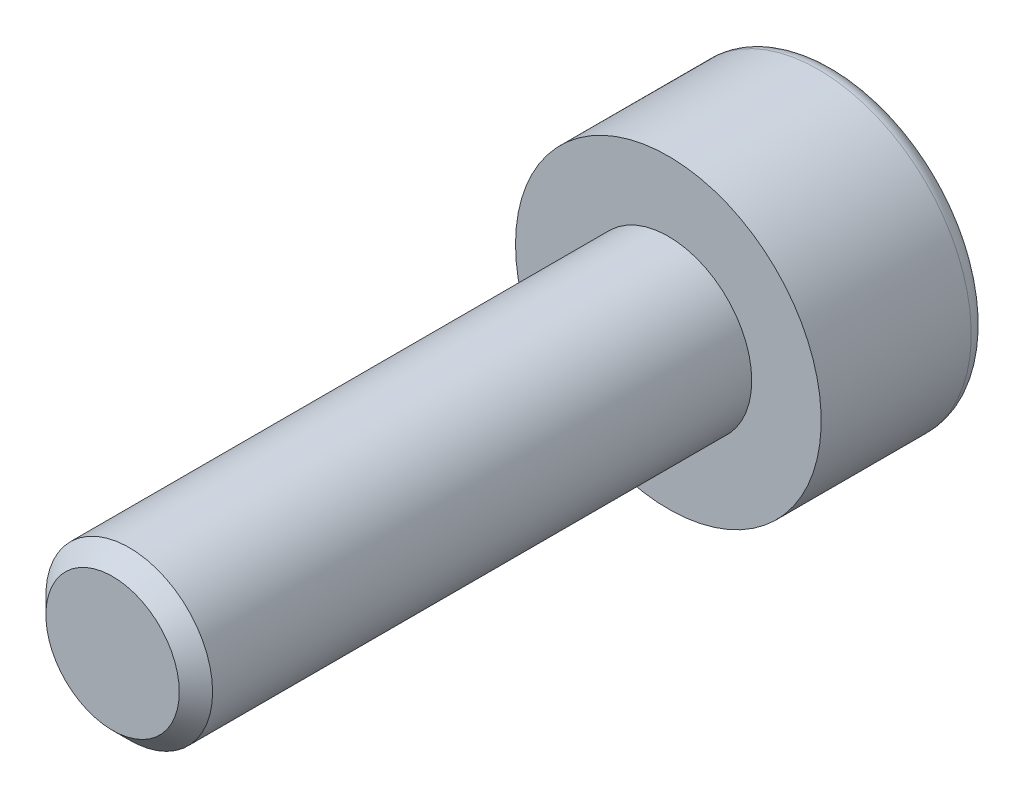
ISO-10303-21;
HEADER;
FILE_DESCRIPTION(('STEP AP214'),'2;1');
FILE_NAME('part.step','',(''),(''),'','','');
FILE_SCHEMA(('AUTOMOTIVE_DESIGN { 1 0 10303 214 1 1 1 1 }'));
ENDSEC;
DATA;
#1=APPLICATION_CONTEXT('core data for automotive mechanical design processes');
#2=APPLICATION_PROTOCOL_DEFINITION('international standard','automotive_design',2000,#1);
#3=PRODUCT_CONTEXT('',#1,'mechanical');
#4=PRODUCT('Part','Part','',(#3));
#5=PRODUCT_RELATED_PRODUCT_CATEGORY('part','',(#4));
#6=PRODUCT_DEFINITION_FORMATION('','',#4);
#7=PRODUCT_DEFINITION_CONTEXT('part definition',#1,'design');
#8=PRODUCT_DEFINITION('design','',#6,#7);
#9=PRODUCT_DEFINITION_SHAPE('','',#8);
#10=(LENGTH_UNIT() NAMED_UNIT(*) SI_UNIT(.MILLI.,.METRE.));
#11=(NAMED_UNIT(*) PLANE_ANGLE_UNIT() SI_UNIT($,.RADIAN.));
#12=(NAMED_UNIT(*) SI_UNIT($,.STERADIAN.) SOLID_ANGLE_UNIT());
#13=UNCERTAINTY_MEASURE_WITH_UNIT(LENGTH_MEASURE(1.E-05),#10,'distance_accuracy_value','');
#14=(GEOMETRIC_REPRESENTATION_CONTEXT(3) GLOBAL_UNCERTAINTY_ASSIGNED_CONTEXT((#13)) GLOBAL_UNIT_ASSIGNED_CONTEXT((#10,
#11,#12)) REPRESENTATION_CONTEXT('',''));
#15=CARTESIAN_POINT('',(0.,0.,0.));
#16=DIRECTION('',(0.,0.,1.));
#17=DIRECTION('',(1.,0.,0.));
#18=AXIS2_PLACEMENT_3D('',#15,#16,#17);
#19=CARTESIAN_POINT('',(0.,0.,-3.));
#20=DIRECTION('',(0.,0.,1.));
#21=DIRECTION('',(1.,0.,0.));
#22=AXIS2_PLACEMENT_3D('',#19,#20,#21);
#23=PLANE('',#22);
#24=CARTESIAN_POINT('',(0.,0.,-3.));
#25=DIRECTION('',(0.,0.,-1.));
#26=DIRECTION('',(-1.,0.,0.));
#27=AXIS2_PLACEMENT_3D('',#24,#25,#26);
#28=CIRCLE('',#27,2.45);
#29=CARTESIAN_POINT('',(-2.45,0.,-3.));
#30=VERTEX_POINT('',#29);
#31=EDGE_CURVE('E149',#30,#30,#28,.T.);
#32=ORIENTED_EDGE('',*,*,#31,.T.);
#33=EDGE_LOOP('',(#32));
#34=FACE_BOUND('',#33,.T.);
#35=DIRECTION('',(-0.86602540378444,0.499999999999998,0.));
#36=VECTOR('',#35,1.);
#37=CARTESIAN_POINT('',(0.,1.73205080756888,-3.));
#38=LINE('',#37,#36);
#39=CARTESIAN_POINT('',(1.5,0.866025403784442,-3.));
#40=VERTEX_POINT('',#39);
#41=CARTESIAN_POINT('',(0.,1.73205080756888,-3.));
#42=VERTEX_POINT('',#41);
#43=EDGE_CURVE('E51',#40,#42,#38,.T.);
#44=ORIENTED_EDGE('',*,*,#43,.T.);
#45=DIRECTION('',(-0.866025403784438,-0.500000000000001,0.));
#46=VECTOR('',#45,1.);
#47=CARTESIAN_POINT('',(0.,1.73205080756888,-3.));
#48=LINE('',#47,#46);
#49=CARTESIAN_POINT('',(-1.5,0.866025403784441,-3.));
#50=VERTEX_POINT('',#49);
#51=EDGE_CURVE('E122',#42,#50,#48,.T.);
#52=ORIENTED_EDGE('',*,*,#51,.T.);
#53=DIRECTION('',(0.,-1.,0.));
#54=VECTOR('',#53,1.);
#55=CARTESIAN_POINT('',(-1.5,-0.866025403784441,-3.));
#56=LINE('',#55,#54);
#57=CARTESIAN_POINT('',(-1.5,-0.866025403784441,-3.));
#58=VERTEX_POINT('',#57);
#59=EDGE_CURVE('E126',#50,#58,#56,.T.);
#60=ORIENTED_EDGE('',*,*,#59,.T.);
#61=DIRECTION('',(0.866025403784438,-0.500000000000001,0.));
#62=VECTOR('',#61,1.);
#63=CARTESIAN_POINT('',(0.,-1.73205080756888,-3.));
#64=LINE('',#63,#62);
#65=CARTESIAN_POINT('',(0.,-1.73205080756888,-3.));
#66=VERTEX_POINT('',#65);
#67=EDGE_CURVE('E129',#58,#66,#64,.T.);
#68=ORIENTED_EDGE('',*,*,#67,.T.);
#69=DIRECTION('',(0.86602540378444,0.499999999999998,0.));
#70=VECTOR('',#69,1.);
#71=CARTESIAN_POINT('',(0.,-1.73205080756888,-3.));
#72=LINE('',#71,#70);
#73=CARTESIAN_POINT('',(1.5,-0.866025403784441,-3.));
#74=VERTEX_POINT('',#73);
#75=EDGE_CURVE('E112',#66,#74,#72,.T.);
#76=ORIENTED_EDGE('',*,*,#75,.T.);
#77=DIRECTION('',(0.,1.,0.));
#78=VECTOR('',#77,1.);
#79=CARTESIAN_POINT('',(1.5,-0.866025403784441,-3.));
#80=LINE('',#79,#78);
#81=EDGE_CURVE('E132',#74,#40,#80,.T.);
#82=ORIENTED_EDGE('',*,*,#81,.T.);
#83=EDGE_LOOP('',(#44,#52,#60,#68,#76,#82));
#84=FACE_BOUND('',#83,.T.);
#85=ADVANCED_FACE('F36',(#34,#84),#23,.F.);
#86=CARTESIAN_POINT('',(0.,0.,-2.7));
#87=DIRECTION('',(0.,0.,-1.));
#88=DIRECTION('',(-1.,0.,0.));
#89=AXIS2_PLACEMENT_3D('',#86,#87,#88);
#90=TOROIDAL_SURFACE('',#89,2.45,0.3);
#91=ORIENTED_EDGE('',*,*,#31,.F.);
#92=EDGE_LOOP('',(#91));
#93=FACE_BOUND('',#92,.T.);
#94=CARTESIAN_POINT('',(0.,0.,-2.7));
#95=DIRECTION('',(0.,0.,-1.));
#96=DIRECTION('',(-1.,0.,0.));
#97=AXIS2_PLACEMENT_3D('',#94,#95,#96);
#98=CIRCLE('',#97,2.75);
#99=CARTESIAN_POINT('',(-2.75,0.,-2.7));
#100=VERTEX_POINT('',#99);
#101=EDGE_CURVE('E146',#100,#100,#98,.T.);
#102=ORIENTED_EDGE('',*,*,#101,.T.);
#103=EDGE_LOOP('',(#102));
#104=FACE_BOUND('',#103,.T.);
#105=ADVANCED_FACE('F166',(#93,#104),#90,.T.);
#106=CARTESIAN_POINT('',(0.,0.,0.));
#107=DIRECTION('',(0.,0.,-1.));
#108=DIRECTION('',(-1.,0.,0.));
#109=AXIS2_PLACEMENT_3D('',#106,#107,#108);
#110=CYLINDRICAL_SURFACE('',#109,2.75);
#111=ORIENTED_EDGE('',*,*,#101,.F.);
#112=EDGE_LOOP('',(#111));
#113=FACE_BOUND('',#112,.T.);
#114=CARTESIAN_POINT('',(0.,0.,0.));
#115=DIRECTION('',(0.,0.,-1.));
#116=DIRECTION('',(-1.,0.,0.));
#117=AXIS2_PLACEMENT_3D('',#114,#115,#116);
#118=CIRCLE('',#117,2.75);
#119=CARTESIAN_POINT('',(-2.75,0.,0.));
#120=VERTEX_POINT('',#119);
#121=EDGE_CURVE('E143',#120,#120,#118,.T.);
#122=ORIENTED_EDGE('',*,*,#121,.T.);
#123=EDGE_LOOP('',(#122));
#124=FACE_BOUND('',#123,.T.);
#125=ADVANCED_FACE('F171',(#113,#124),#110,.T.);
#126=CARTESIAN_POINT('',(0.,0.,0.));
#127=DIRECTION('',(0.,0.,-1.));
#128=DIRECTION('',(-1.,0.,0.));
#129=AXIS2_PLACEMENT_3D('',#126,#127,#128);
#130=PLANE('',#129);
#131=CARTESIAN_POINT('',(0.,0.,0.));
#132=DIRECTION('',(0.,0.,1.));
#133=DIRECTION('',(1.,0.,0.));
#134=AXIS2_PLACEMENT_3D('',#131,#132,#133);
#135=CIRCLE('',#134,1.5);
#136=CARTESIAN_POINT('',(1.5,0.,0.));
#137=VERTEX_POINT('',#136);
#138=EDGE_CURVE('E123',#137,#137,#135,.T.);
#139=ORIENTED_EDGE('',*,*,#138,.F.);
#140=EDGE_LOOP('',(#139));
#141=FACE_BOUND('',#140,.T.);
#142=ORIENTED_EDGE('',*,*,#121,.F.);
#143=EDGE_LOOP('',(#142));
#144=FACE_BOUND('',#143,.T.);
#145=ADVANCED_FACE('F178',(#141,#144),#130,.F.);
#146=CARTESIAN_POINT('',(0.,1.73205080756888,-1.));
#147=DIRECTION('',(-0.499999999999998,-0.86602540378444,0.));
#148=DIRECTION('',(0.86602540378444,-0.499999999999998,0.));
#149=AXIS2_PLACEMENT_3D('',#146,#147,#148);
#150=PLANE('',#149);
#151=ORIENTED_EDGE('',*,*,#43,.F.);
#152=DIRECTION('',(0.,0.,-1.));
#153=VECTOR('',#152,1.);
#154=CARTESIAN_POINT('',(1.5,0.866025403784442,-1.));
#155=LINE('',#154,#153);
#156=CARTESIAN_POINT('',(1.5,0.866025403784442,-1.));
#157=VERTEX_POINT('',#156);
#158=EDGE_CURVE('E117',#157,#40,#155,.T.);
#159=ORIENTED_EDGE('',*,*,#158,.F.);
#160=DIRECTION('',(-0.86602540378444,0.499999999999998,0.));
#161=VECTOR('',#160,1.);
#162=CARTESIAN_POINT('',(0.,1.73205080756888,-1.));
#163=LINE('',#162,#161);
#164=CARTESIAN_POINT('',(0.,1.73205080756888,-1.));
#165=VERTEX_POINT('',#164);
#166=EDGE_CURVE('E135',#157,#165,#163,.T.);
#167=ORIENTED_EDGE('',*,*,#166,.T.);
#168=DIRECTION('',(0.,0.,-1.));
#169=VECTOR('',#168,1.);
#170=CARTESIAN_POINT('',(0.,1.73205080756888,-1.));
#171=LINE('',#170,#169);
#172=EDGE_CURVE('E141',#165,#42,#171,.T.);
#173=ORIENTED_EDGE('',*,*,#172,.T.);
#174=EDGE_LOOP('',(#151,#159,#167,#173));
#175=FACE_BOUND('',#174,.T.);
#176=ADVANCED_FACE('F182',(#175),#150,.T.);
#177=CARTESIAN_POINT('',(0.,1.73205080756888,-1.));
#178=DIRECTION('',(0.500000000000001,-0.866025403784438,0.));
#179=DIRECTION('',(0.866025403784438,0.500000000000001,0.));
#180=AXIS2_PLACEMENT_3D('',#177,#178,#179);
#181=PLANE('',#180);
#182=ORIENTED_EDGE('',*,*,#51,.F.);
#183=ORIENTED_EDGE('',*,*,#172,.F.);
#184=DIRECTION('',(-0.866025403784438,-0.500000000000001,0.));
#185=VECTOR('',#184,1.);
#186=CARTESIAN_POINT('',(0.,1.73205080756888,-1.));
#187=LINE('',#186,#185);
#188=CARTESIAN_POINT('',(-1.5,0.866025403784441,-1.));
#189=VERTEX_POINT('',#188);
#190=EDGE_CURVE('E90',#165,#189,#187,.T.);
#191=ORIENTED_EDGE('',*,*,#190,.T.);
#192=DIRECTION('',(0.,0.,-1.));
#193=VECTOR('',#192,1.);
#194=CARTESIAN_POINT('',(-1.5,0.866025403784441,-1.));
#195=LINE('',#194,#193);
#196=EDGE_CURVE('E139',#189,#50,#195,.T.);
#197=ORIENTED_EDGE('',*,*,#196,.T.);
#198=EDGE_LOOP('',(#182,#183,#191,#197));
#199=FACE_BOUND('',#198,.T.);
#200=ADVANCED_FACE('F186',(#199),#181,.T.);
#201=CARTESIAN_POINT('',(-1.5,-0.866025403784441,-1.));
#202=DIRECTION('',(1.,0.,0.));
#203=DIRECTION('',(0.,0.,-1.));
#204=AXIS2_PLACEMENT_3D('',#201,#202,#203);
#205=PLANE('',#204);
#206=ORIENTED_EDGE('',*,*,#59,.F.);
#207=ORIENTED_EDGE('',*,*,#196,.F.);
#208=DIRECTION('',(0.,-1.,0.));
#209=VECTOR('',#208,1.);
#210=CARTESIAN_POINT('',(-1.5,-0.866025403784441,-1.));
#211=LINE('',#210,#209);
#212=CARTESIAN_POINT('',(-1.5,-0.866025403784441,-1.));
#213=VERTEX_POINT('',#212);
#214=EDGE_CURVE('E108',#189,#213,#211,.T.);
#215=ORIENTED_EDGE('',*,*,#214,.T.);
#216=DIRECTION('',(0.,0.,-1.));
#217=VECTOR('',#216,1.);
#218=CARTESIAN_POINT('',(-1.5,-0.866025403784441,-1.));
#219=LINE('',#218,#217);
#220=EDGE_CURVE('E105',#213,#58,#219,.T.);
#221=ORIENTED_EDGE('',*,*,#220,.T.);
#222=EDGE_LOOP('',(#206,#207,#215,#221));
#223=FACE_BOUND('',#222,.T.);
#224=ADVANCED_FACE('F189',(#223),#205,.T.);
#225=CARTESIAN_POINT('',(0.,-1.73205080756888,-1.));
#226=DIRECTION('',(0.500000000000001,0.866025403784438,0.));
#227=DIRECTION('',(-0.866025403784438,0.500000000000001,0.));
#228=AXIS2_PLACEMENT_3D('',#225,#226,#227);
#229=PLANE('',#228);
#230=ORIENTED_EDGE('',*,*,#67,.F.);
#231=ORIENTED_EDGE('',*,*,#220,.F.);
#232=DIRECTION('',(0.866025403784438,-0.500000000000001,0.));
#233=VECTOR('',#232,1.);
#234=CARTESIAN_POINT('',(0.,-1.73205080756888,-1.));
#235=LINE('',#234,#233);
#236=CARTESIAN_POINT('',(0.,-1.73205080756888,-1.));
#237=VERTEX_POINT('',#236);
#238=EDGE_CURVE('E100',#213,#237,#235,.T.);
#239=ORIENTED_EDGE('',*,*,#238,.T.);
#240=DIRECTION('',(0.,0.,-1.));
#241=VECTOR('',#240,1.);
#242=CARTESIAN_POINT('',(0.,-1.73205080756888,-1.));
#243=LINE('',#242,#241);
#244=EDGE_CURVE('E104',#237,#66,#243,.T.);
#245=ORIENTED_EDGE('',*,*,#244,.T.);
#246=EDGE_LOOP('',(#230,#231,#239,#245));
#247=FACE_BOUND('',#246,.T.);
#248=ADVANCED_FACE('F103',(#247),#229,.T.);
#249=CARTESIAN_POINT('',(0.,-1.73205080756888,-1.));
#250=DIRECTION('',(-0.499999999999998,0.86602540378444,0.));
#251=DIRECTION('',(-0.86602540378444,-0.499999999999998,0.));
#252=AXIS2_PLACEMENT_3D('',#249,#250,#251);
#253=PLANE('',#252);
#254=ORIENTED_EDGE('',*,*,#75,.F.);
#255=ORIENTED_EDGE('',*,*,#244,.F.);
#256=DIRECTION('',(0.86602540378444,0.499999999999998,0.));
#257=VECTOR('',#256,1.);
#258=CARTESIAN_POINT('',(0.,-1.73205080756888,-1.));
#259=LINE('',#258,#257);
#260=CARTESIAN_POINT('',(1.5,-0.866025403784441,-1.));
#261=VERTEX_POINT('',#260);
#262=EDGE_CURVE('E107',#237,#261,#259,.T.);
#263=ORIENTED_EDGE('',*,*,#262,.T.);
#264=DIRECTION('',(0.,0.,-1.));
#265=VECTOR('',#264,1.);
#266=CARTESIAN_POINT('',(1.5,-0.866025403784441,-1.));
#267=LINE('',#266,#265);
#268=EDGE_CURVE('E81',#261,#74,#267,.T.);
#269=ORIENTED_EDGE('',*,*,#268,.T.);
#270=EDGE_LOOP('',(#254,#255,#263,#269));
#271=FACE_BOUND('',#270,.T.);
#272=ADVANCED_FACE('F110',(#271),#253,.T.);
#273=CARTESIAN_POINT('',(1.5,-0.866025403784441,-1.));
#274=DIRECTION('',(-1.,0.,0.));
#275=DIRECTION('',(0.,0.,1.));
#276=AXIS2_PLACEMENT_3D('',#273,#274,#275);
#277=PLANE('',#276);
#278=ORIENTED_EDGE('',*,*,#81,.F.);
#279=ORIENTED_EDGE('',*,*,#268,.F.);
#280=DIRECTION('',(0.,1.,0.));
#281=VECTOR('',#280,1.);
#282=CARTESIAN_POINT('',(1.5,-0.866025403784441,-1.));
#283=LINE('',#282,#281);
#284=EDGE_CURVE('E59',#261,#157,#283,.T.);
#285=ORIENTED_EDGE('',*,*,#284,.T.);
#286=ORIENTED_EDGE('',*,*,#158,.T.);
#287=EDGE_LOOP('',(#278,#279,#285,#286));
#288=FACE_BOUND('',#287,.T.);
#289=ADVANCED_FACE('F198',(#288),#277,.T.);
#290=CARTESIAN_POINT('',(1.5,0.866025403784442,-1.));
#291=DIRECTION('',(0.,0.,1.));
#292=DIRECTION('',(1.,0.,0.));
#293=AXIS2_PLACEMENT_3D('',#290,#291,#292);
#294=PLANE('',#293);
#295=ORIENTED_EDGE('',*,*,#166,.F.);
#296=ORIENTED_EDGE('',*,*,#284,.F.);
#297=ORIENTED_EDGE('',*,*,#262,.F.);
#298=ORIENTED_EDGE('',*,*,#238,.F.);
#299=ORIENTED_EDGE('',*,*,#214,.F.);
#300=ORIENTED_EDGE('',*,*,#190,.F.);
#301=EDGE_LOOP('',(#295,#296,#297,#298,#299,#300));
#302=FACE_BOUND('',#301,.T.);
#303=ADVANCED_FACE('F115',(#302),#294,.F.);
#304=CARTESIAN_POINT('',(0.,0.,10.));
#305=DIRECTION('',(0.,0.,1.));
#306=DIRECTION('',(1.,0.,0.));
#307=AXIS2_PLACEMENT_3D('',#304,#305,#306);
#308=PLANE('',#307);
#309=CARTESIAN_POINT('',(0.,0.,10.));
#310=DIRECTION('',(0.,0.,1.));
#311=DIRECTION('',(1.,0.,0.));
#312=AXIS2_PLACEMENT_3D('',#309,#310,#311);
#313=CIRCLE('',#312,1.2);
#314=CARTESIAN_POINT('',(1.2,0.,10.));
#315=VERTEX_POINT('',#314);
#316=EDGE_CURVE('E44',#315,#315,#313,.T.);
#317=ORIENTED_EDGE('',*,*,#316,.T.);
#318=EDGE_LOOP('',(#317));
#319=FACE_BOUND('',#318,.T.);
#320=ADVANCED_FACE('F154',(#319),#308,.T.);
#321=CARTESIAN_POINT('',(0.,0.,0.));
#322=DIRECTION('',(0.,0.,1.));
#323=DIRECTION('',(1.,0.,0.));
#324=AXIS2_PLACEMENT_3D('',#321,#322,#323);
#325=CYLINDRICAL_SURFACE('',#324,1.5);
#326=CARTESIAN_POINT('',(0.,0.,9.7));
#327=DIRECTION('',(0.,0.,1.));
#328=DIRECTION('',(1.,0.,0.));
#329=AXIS2_PLACEMENT_3D('',#326,#327,#328);
#330=CIRCLE('',#329,1.5);
#331=CARTESIAN_POINT('',(1.5,0.,9.7));
#332=VERTEX_POINT('',#331);
#333=EDGE_CURVE('E11',#332,#332,#330,.F.);
#334=ORIENTED_EDGE('',*,*,#333,.T.);
#335=EDGE_LOOP('',(#334));
#336=FACE_BOUND('',#335,.T.);
#337=ORIENTED_EDGE('',*,*,#138,.T.);
#338=EDGE_LOOP('',(#337));
#339=FACE_BOUND('',#338,.T.);
#340=ADVANCED_FACE('F157',(#336,#339),#325,.T.);
#341=CARTESIAN_POINT('',(0.,0.,10.));
#342=DIRECTION('',(0.,0.,-1.));
#343=DIRECTION('',(-1.,0.,0.));
#344=AXIS2_PLACEMENT_3D('',#341,#342,#343);
#345=CONICAL_SURFACE('',#344,1.2,0.785398163397448);
#346=ORIENTED_EDGE('',*,*,#333,.F.);
#347=EDGE_LOOP('',(#346));
#348=FACE_BOUND('',#347,.T.);
#349=ORIENTED_EDGE('',*,*,#316,.F.);
#350=EDGE_LOOP('',(#349));
#351=FACE_BOUND('',#350,.T.);
#352=ADVANCED_FACE('F38',(#348,#351),#345,.T.);
#353=CLOSED_SHELL('',(#85,#105,#125,#145,#176,#200,#224,#248,#272,#289,#303,#320,#340,#352));
#354=MANIFOLD_SOLID_BREP('B2',#353);
#355=ADVANCED_BREP_SHAPE_REPRESENTATION('',(#18,#354),#14);
#356=SHAPE_DEFINITION_REPRESENTATION(#9,#355);
ENDSEC;
END-ISO-10303-21;
